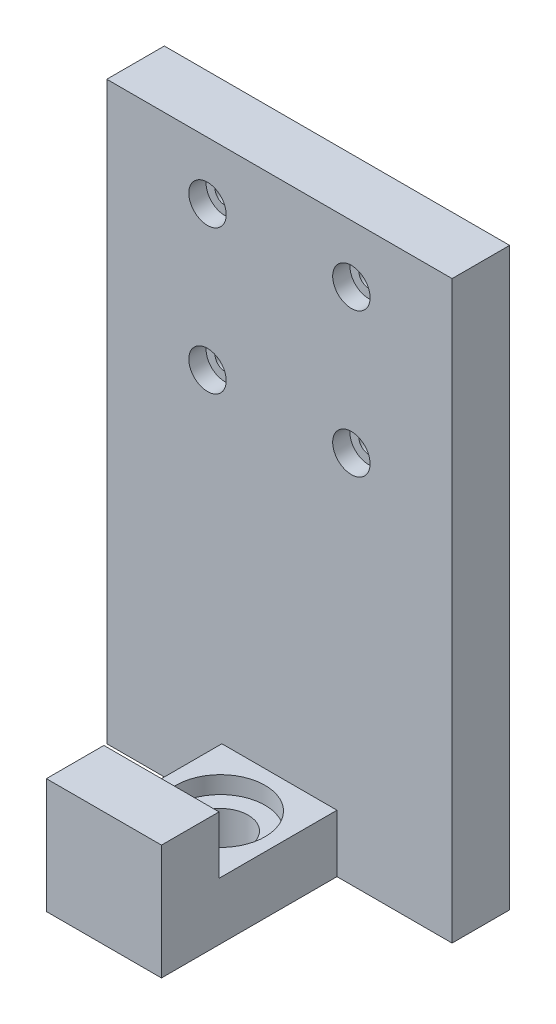
ISO-10303-21;
HEADER;
FILE_DESCRIPTION(('STEP AP214'),'2;1');
FILE_NAME('part.step','',(''),(''),'','','');
FILE_SCHEMA(('AUTOMOTIVE_DESIGN { 1 0 10303 214 1 1 1 1 }'));
ENDSEC;
DATA;
#1=APPLICATION_CONTEXT('core data for automotive mechanical design processes');
#2=APPLICATION_PROTOCOL_DEFINITION('international standard','automotive_design',2000,#1);
#3=PRODUCT_CONTEXT('',#1,'mechanical');
#4=PRODUCT('Part','Part','',(#3));
#5=PRODUCT_RELATED_PRODUCT_CATEGORY('part','',(#4));
#6=PRODUCT_DEFINITION_FORMATION('','',#4);
#7=PRODUCT_DEFINITION_CONTEXT('part definition',#1,'design');
#8=PRODUCT_DEFINITION('design','',#6,#7);
#9=PRODUCT_DEFINITION_SHAPE('','',#8);
#10=(LENGTH_UNIT() NAMED_UNIT(*) SI_UNIT(.MILLI.,.METRE.));
#11=(NAMED_UNIT(*) PLANE_ANGLE_UNIT() SI_UNIT($,.RADIAN.));
#12=(NAMED_UNIT(*) SI_UNIT($,.STERADIAN.) SOLID_ANGLE_UNIT());
#13=UNCERTAINTY_MEASURE_WITH_UNIT(LENGTH_MEASURE(1.E-05),#10,'distance_accuracy_value','');
#14=(GEOMETRIC_REPRESENTATION_CONTEXT(3) GLOBAL_UNCERTAINTY_ASSIGNED_CONTEXT((#13)) GLOBAL_UNIT_ASSIGNED_CONTEXT((#10,
#11,#12)) REPRESENTATION_CONTEXT('',''));
#15=CARTESIAN_POINT('',(0.,0.,0.));
#16=DIRECTION('',(0.,0.,1.));
#17=DIRECTION('',(1.,0.,0.));
#18=AXIS2_PLACEMENT_3D('',#15,#16,#17);
#19=CARTESIAN_POINT('',(-19.2632914223823,-11.696004332368,40.5));
#20=DIRECTION('',(0.,-1.,0.));
#21=DIRECTION('',(0.,0.,-1.));
#22=AXIS2_PLACEMENT_3D('',#19,#20,#21);
#23=PLANE('',#22);
#24=CARTESIAN_POINT('',(-9.26329142238234,-11.696004332368,20.25));
#25=DIRECTION('',(0.,1.,0.));
#26=DIRECTION('',(0.,0.,1.));
#27=AXIS2_PLACEMENT_3D('',#24,#25,#26);
#28=CIRCLE('',#27,7.75);
#29=CARTESIAN_POINT('',(-9.26329142238234,-11.696004332368,28.));
#30=VERTEX_POINT('',#29);
#31=EDGE_CURVE('E143',#30,#30,#28,.T.);
#32=ORIENTED_EDGE('',*,*,#31,.F.);
#33=EDGE_LOOP('',(#32));
#34=FACE_BOUND('',#33,.T.);
#35=DIRECTION('',(-1.,0.,0.));
#36=VECTOR('',#35,1.);
#37=CARTESIAN_POINT('',(-19.2632914223823,-11.696004332368,30.5));
#38=LINE('',#37,#36);
#39=CARTESIAN_POINT('',(0.736708577617665,-11.696004332368,30.5));
#40=VERTEX_POINT('',#39);
#41=CARTESIAN_POINT('',(-19.2632914223823,-11.696004332368,30.5));
#42=VERTEX_POINT('',#41);
#43=EDGE_CURVE('E138',#40,#42,#38,.T.);
#44=ORIENTED_EDGE('',*,*,#43,.F.);
#45=DIRECTION('',(0.,0.,-1.));
#46=VECTOR('',#45,1.);
#47=CARTESIAN_POINT('',(0.736708577617665,-11.696004332368,40.5));
#48=LINE('',#47,#46);
#49=CARTESIAN_POINT('',(0.736708577617665,-11.696004332368,10.));
#50=VERTEX_POINT('',#49);
#51=EDGE_CURVE('E158',#40,#50,#48,.T.);
#52=ORIENTED_EDGE('',*,*,#51,.T.);
#53=DIRECTION('',(-1.,0.,0.));
#54=VECTOR('',#53,1.);
#55=CARTESIAN_POINT('',(-19.2632914223823,-11.696004332368,10.));
#56=LINE('',#55,#54);
#57=CARTESIAN_POINT('',(-19.2632914223823,-11.696004332368,10.));
#58=VERTEX_POINT('',#57);
#59=EDGE_CURVE('E123',#50,#58,#56,.T.);
#60=ORIENTED_EDGE('',*,*,#59,.T.);
#61=DIRECTION('',(0.,0.,-1.));
#62=VECTOR('',#61,1.);
#63=CARTESIAN_POINT('',(-19.2632914223823,-11.696004332368,40.5));
#64=LINE('',#63,#62);
#65=EDGE_CURVE('E49',#42,#58,#64,.T.);
#66=ORIENTED_EDGE('',*,*,#65,.F.);
#67=EDGE_LOOP('',(#44,#52,#60,#66));
#68=FACE_BOUND('',#67,.T.);
#69=ADVANCED_FACE('F31',(#34,#68),#23,.F.);
#70=CARTESIAN_POINT('',(-39.2632914223823,78.303995667632,10.));
#71=DIRECTION('',(1.,0.,0.));
#72=DIRECTION('',(0.,1.,0.));
#73=AXIS2_PLACEMENT_3D('',#70,#71,#72);
#74=PLANE('',#73);
#75=DIRECTION('',(0.,-1.,0.));
#76=VECTOR('',#75,1.);
#77=CARTESIAN_POINT('',(-39.2632914223823,78.303995667632,0.));
#78=LINE('',#77,#76);
#79=CARTESIAN_POINT('',(-39.2632914223823,78.303995667632,0.));
#80=VERTEX_POINT('',#79);
#81=CARTESIAN_POINT('',(-39.2632914223823,-21.696004332368,0.));
#82=VERTEX_POINT('',#81);
#83=EDGE_CURVE('E190',#80,#82,#78,.T.);
#84=ORIENTED_EDGE('',*,*,#83,.T.);
#85=DIRECTION('',(0.,0.,-1.));
#86=VECTOR('',#85,1.);
#87=CARTESIAN_POINT('',(-39.2632914223823,-21.696004332368,10.));
#88=LINE('',#87,#86);
#89=CARTESIAN_POINT('',(-39.2632914223823,-21.696004332368,10.));
#90=VERTEX_POINT('',#89);
#91=EDGE_CURVE('E11',#90,#82,#88,.T.);
#92=ORIENTED_EDGE('',*,*,#91,.F.);
#93=DIRECTION('',(0.,-1.,0.));
#94=VECTOR('',#93,1.);
#95=CARTESIAN_POINT('',(-39.2632914223823,78.303995667632,10.));
#96=LINE('',#95,#94);
#97=CARTESIAN_POINT('',(-39.2632914223823,78.303995667632,10.));
#98=VERTEX_POINT('',#97);
#99=EDGE_CURVE('E161',#98,#90,#96,.T.);
#100=ORIENTED_EDGE('',*,*,#99,.F.);
#101=DIRECTION('',(0.,0.,-1.));
#102=VECTOR('',#101,1.);
#103=CARTESIAN_POINT('',(-39.2632914223823,78.303995667632,10.));
#104=LINE('',#103,#102);
#105=EDGE_CURVE('E181',#98,#80,#104,.T.);
#106=ORIENTED_EDGE('',*,*,#105,.T.);
#107=EDGE_LOOP('',(#84,#92,#100,#106));
#108=FACE_BOUND('',#107,.T.);
#109=ADVANCED_FACE('F33',(#108),#74,.F.);
#110=CARTESIAN_POINT('',(-39.2632914223823,-21.696004332368,10.));
#111=DIRECTION('',(0.,1.,0.));
#112=DIRECTION('',(0.,0.,1.));
#113=AXIS2_PLACEMENT_3D('',#110,#111,#112);
#114=PLANE('',#113);
#115=CARTESIAN_POINT('',(-9.26329142238234,-21.696004332368,20.25));
#116=DIRECTION('',(0.,1.,0.));
#117=DIRECTION('',(0.,0.,1.));
#118=AXIS2_PLACEMENT_3D('',#115,#116,#117);
#119=CIRCLE('',#118,4.8);
#120=CARTESIAN_POINT('',(-9.26329142238234,-21.696004332368,25.05));
#121=VERTEX_POINT('',#120);
#122=EDGE_CURVE('E377',#121,#121,#119,.T.);
#123=ORIENTED_EDGE('',*,*,#122,.T.);
#124=EDGE_LOOP('',(#123));
#125=FACE_BOUND('',#124,.T.);
#126=DIRECTION('',(1.,0.,0.));
#127=VECTOR('',#126,1.);
#128=CARTESIAN_POINT('',(-39.2632914223823,-21.696004332368,0.));
#129=LINE('',#128,#127);
#130=CARTESIAN_POINT('',(20.7367085776177,-21.696004332368,0.));
#131=VERTEX_POINT('',#130);
#132=EDGE_CURVE('E188',#82,#131,#129,.T.);
#133=ORIENTED_EDGE('',*,*,#132,.T.);
#134=DIRECTION('',(0.,0.,-1.));
#135=VECTOR('',#134,1.);
#136=CARTESIAN_POINT('',(20.7367085776177,-21.696004332368,10.));
#137=LINE('',#136,#135);
#138=CARTESIAN_POINT('',(20.7367085776177,-21.696004332368,10.));
#139=VERTEX_POINT('',#138);
#140=EDGE_CURVE('E41',#139,#131,#137,.T.);
#141=ORIENTED_EDGE('',*,*,#140,.F.);
#142=DIRECTION('',(1.,0.,0.));
#143=VECTOR('',#142,1.);
#144=CARTESIAN_POINT('',(-39.2632914223823,-21.696004332368,10.));
#145=LINE('',#144,#143);
#146=CARTESIAN_POINT('',(0.736708577617665,-21.696004332368,10.));
#147=VERTEX_POINT('',#146);
#148=EDGE_CURVE('E164',#147,#139,#145,.T.);
#149=ORIENTED_EDGE('',*,*,#148,.F.);
#150=DIRECTION('',(0.,0.,-1.));
#151=VECTOR('',#150,1.);
#152=CARTESIAN_POINT('',(0.73670857761767,-21.696004332368,40.5));
#153=LINE('',#152,#151);
#154=CARTESIAN_POINT('',(0.73670857761767,-21.696004332368,40.5));
#155=VERTEX_POINT('',#154);
#156=EDGE_CURVE('E160',#155,#147,#153,.T.);
#157=ORIENTED_EDGE('',*,*,#156,.F.);
#158=DIRECTION('',(1.,0.,0.));
#159=VECTOR('',#158,1.);
#160=CARTESIAN_POINT('',(-19.2632914223823,-21.696004332368,40.5));
#161=LINE('',#160,#159);
#162=CARTESIAN_POINT('',(-19.2632914223823,-21.696004332368,40.5));
#163=VERTEX_POINT('',#162);
#164=EDGE_CURVE('E122',#163,#155,#161,.T.);
#165=ORIENTED_EDGE('',*,*,#164,.F.);
#166=DIRECTION('',(0.,0.,-1.));
#167=VECTOR('',#166,1.);
#168=CARTESIAN_POINT('',(-19.2632914223823,-21.696004332368,40.5));
#169=LINE('',#168,#167);
#170=CARTESIAN_POINT('',(-19.2632914223823,-21.696004332368,10.));
#171=VERTEX_POINT('',#170);
#172=EDGE_CURVE('E120',#163,#171,#169,.T.);
#173=ORIENTED_EDGE('',*,*,#172,.T.);
#174=EDGE_CURVE('E174',#90,#171,#145,.T.);
#175=ORIENTED_EDGE('',*,*,#174,.F.);
#176=ORIENTED_EDGE('',*,*,#91,.T.);
#177=EDGE_LOOP('',(#133,#141,#149,#157,#165,#173,#175,#176));
#178=FACE_BOUND('',#177,.T.);
#179=ADVANCED_FACE('F209',(#125,#178),#114,.F.);
#180=CARTESIAN_POINT('',(20.7367085776177,78.303995667632,10.));
#181=DIRECTION('',(-1.,0.,0.));
#182=DIRECTION('',(0.,-1.,0.));
#183=AXIS2_PLACEMENT_3D('',#180,#181,#182);
#184=PLANE('',#183);
#185=DIRECTION('',(0.,1.,0.));
#186=VECTOR('',#185,1.);
#187=CARTESIAN_POINT('',(20.7367085776177,78.303995667632,0.));
#188=LINE('',#187,#186);
#189=CARTESIAN_POINT('',(20.7367085776177,78.303995667632,0.));
#190=VERTEX_POINT('',#189);
#191=EDGE_CURVE('E186',#131,#190,#188,.T.);
#192=ORIENTED_EDGE('',*,*,#191,.T.);
#193=DIRECTION('',(0.,0.,-1.));
#194=VECTOR('',#193,1.);
#195=CARTESIAN_POINT('',(20.7367085776177,78.303995667632,10.));
#196=LINE('',#195,#194);
#197=CARTESIAN_POINT('',(20.7367085776177,78.303995667632,10.));
#198=VERTEX_POINT('',#197);
#199=EDGE_CURVE('E178',#198,#190,#196,.T.);
#200=ORIENTED_EDGE('',*,*,#199,.F.);
#201=DIRECTION('',(0.,1.,0.));
#202=VECTOR('',#201,1.);
#203=CARTESIAN_POINT('',(20.7367085776177,78.303995667632,10.));
#204=LINE('',#203,#202);
#205=EDGE_CURVE('E168',#139,#198,#204,.T.);
#206=ORIENTED_EDGE('',*,*,#205,.F.);
#207=ORIENTED_EDGE('',*,*,#140,.T.);
#208=EDGE_LOOP('',(#192,#200,#206,#207));
#209=FACE_BOUND('',#208,.T.);
#210=ADVANCED_FACE('F199',(#209),#184,.F.);
#211=CARTESIAN_POINT('',(-39.2632914223823,78.303995667632,10.));
#212=DIRECTION('',(0.,-1.,0.));
#213=DIRECTION('',(0.,0.,-1.));
#214=AXIS2_PLACEMENT_3D('',#211,#212,#213);
#215=PLANE('',#214);
#216=DIRECTION('',(-1.,0.,0.));
#217=VECTOR('',#216,1.);
#218=CARTESIAN_POINT('',(-39.2632914223823,78.303995667632,0.));
#219=LINE('',#218,#217);
#220=EDGE_CURVE('E165',#190,#80,#219,.T.);
#221=ORIENTED_EDGE('',*,*,#220,.T.);
#222=ORIENTED_EDGE('',*,*,#105,.F.);
#223=DIRECTION('',(-1.,0.,0.));
#224=VECTOR('',#223,1.);
#225=CARTESIAN_POINT('',(-39.2632914223823,78.303995667632,10.));
#226=LINE('',#225,#224);
#227=EDGE_CURVE('E184',#198,#98,#226,.T.);
#228=ORIENTED_EDGE('',*,*,#227,.F.);
#229=ORIENTED_EDGE('',*,*,#199,.T.);
#230=EDGE_LOOP('',(#221,#222,#228,#229));
#231=FACE_BOUND('',#230,.T.);
#232=ADVANCED_FACE('F203',(#231),#215,.F.);
#233=CARTESIAN_POINT('',(-39.2632914223823,-21.696004332368,10.));
#234=DIRECTION('',(0.,0.,1.));
#235=DIRECTION('',(1.,0.,0.));
#236=AXIS2_PLACEMENT_3D('',#233,#234,#235);
#237=PLANE('',#236);
#238=CARTESIAN_POINT('',(-21.7632914223823,68.303995667632,10.));
#239=DIRECTION('',(0.,0.,1.));
#240=DIRECTION('',(1.,0.,0.));
#241=AXIS2_PLACEMENT_3D('',#238,#239,#240);
#242=CIRCLE('',#241,3.25);
#243=CARTESIAN_POINT('',(-18.5132914223823,68.303995667632,10.));
#244=VERTEX_POINT('',#243);
#245=EDGE_CURVE('E332',#244,#244,#242,.T.);
#246=ORIENTED_EDGE('',*,*,#245,.F.);
#247=EDGE_LOOP('',(#246));
#248=FACE_BOUND('',#247,.T.);
#249=CARTESIAN_POINT('',(-21.7632914223823,43.303995667632,10.));
#250=DIRECTION('',(0.,0.,1.));
#251=DIRECTION('',(1.,0.,0.));
#252=AXIS2_PLACEMENT_3D('',#249,#250,#251);
#253=CIRCLE('',#252,3.25);
#254=CARTESIAN_POINT('',(-18.5132914223823,43.303995667632,10.));
#255=VERTEX_POINT('',#254);
#256=EDGE_CURVE('E347',#255,#255,#253,.T.);
#257=ORIENTED_EDGE('',*,*,#256,.F.);
#258=EDGE_LOOP('',(#257));
#259=FACE_BOUND('',#258,.T.);
#260=CARTESIAN_POINT('',(3.23670857761767,68.303995667632,10.));
#261=DIRECTION('',(0.,0.,1.));
#262=DIRECTION('',(1.,0.,0.));
#263=AXIS2_PLACEMENT_3D('',#260,#261,#262);
#264=CIRCLE('',#263,3.25);
#265=CARTESIAN_POINT('',(6.48670857761767,68.303995667632,10.));
#266=VERTEX_POINT('',#265);
#267=EDGE_CURVE('E359',#266,#266,#264,.T.);
#268=ORIENTED_EDGE('',*,*,#267,.F.);
#269=EDGE_LOOP('',(#268));
#270=FACE_BOUND('',#269,.T.);
#271=CARTESIAN_POINT('',(3.23670857761766,43.303995667632,10.));
#272=DIRECTION('',(0.,0.,1.));
#273=DIRECTION('',(1.,0.,0.));
#274=AXIS2_PLACEMENT_3D('',#271,#272,#273);
#275=CIRCLE('',#274,3.25);
#276=CARTESIAN_POINT('',(6.48670857761766,43.303995667632,10.));
#277=VERTEX_POINT('',#276);
#278=EDGE_CURVE('E371',#277,#277,#275,.T.);
#279=ORIENTED_EDGE('',*,*,#278,.F.);
#280=EDGE_LOOP('',(#279));
#281=FACE_BOUND('',#280,.T.);
#282=DIRECTION('',(0.,-1.,0.));
#283=VECTOR('',#282,1.);
#284=CARTESIAN_POINT('',(-19.2632914223823,-11.696004332368,10.));
#285=LINE('',#284,#283);
#286=EDGE_CURVE('E35',#58,#171,#285,.T.);
#287=ORIENTED_EDGE('',*,*,#286,.F.);
#288=ORIENTED_EDGE('',*,*,#59,.F.);
#289=DIRECTION('',(0.,1.,0.));
#290=VECTOR('',#289,1.);
#291=CARTESIAN_POINT('',(0.736708577617665,-11.696004332368,10.));
#292=LINE('',#291,#290);
#293=EDGE_CURVE('E57',#147,#50,#292,.T.);
#294=ORIENTED_EDGE('',*,*,#293,.F.);
#295=ORIENTED_EDGE('',*,*,#148,.T.);
#296=ORIENTED_EDGE('',*,*,#205,.T.);
#297=ORIENTED_EDGE('',*,*,#227,.T.);
#298=ORIENTED_EDGE('',*,*,#99,.T.);
#299=ORIENTED_EDGE('',*,*,#174,.T.);
#300=EDGE_LOOP('',(#287,#288,#294,#295,#296,#297,#298,#299));
#301=FACE_BOUND('',#300,.T.);
#302=ADVANCED_FACE('F196',(#248,#259,#270,#281,#301),#237,.T.);
#303=CARTESIAN_POINT('',(-39.2632914223823,-21.696004332368,0.));
#304=DIRECTION('',(0.,0.,1.));
#305=DIRECTION('',(1.,0.,0.));
#306=AXIS2_PLACEMENT_3D('',#303,#304,#305);
#307=PLANE('',#306);
#308=CARTESIAN_POINT('',(-21.7632914223823,68.303995667632,0.));
#309=DIRECTION('',(0.,0.,1.));
#310=DIRECTION('',(1.,0.,0.));
#311=AXIS2_PLACEMENT_3D('',#308,#309,#310);
#312=CIRCLE('',#311,1.7);
#313=CARTESIAN_POINT('',(-20.0632914223823,68.303995667632,0.));
#314=VERTEX_POINT('',#313);
#315=EDGE_CURVE('E325',#314,#314,#312,.T.);
#316=ORIENTED_EDGE('',*,*,#315,.T.);
#317=EDGE_LOOP('',(#316));
#318=FACE_BOUND('',#317,.T.);
#319=CARTESIAN_POINT('',(-21.7632914223823,43.303995667632,0.));
#320=DIRECTION('',(0.,0.,1.));
#321=DIRECTION('',(1.,0.,0.));
#322=AXIS2_PLACEMENT_3D('',#319,#320,#321);
#323=CIRCLE('',#322,1.7);
#324=CARTESIAN_POINT('',(-20.0632914223823,43.303995667632,0.));
#325=VERTEX_POINT('',#324);
#326=EDGE_CURVE('E338',#325,#325,#323,.T.);
#327=ORIENTED_EDGE('',*,*,#326,.T.);
#328=EDGE_LOOP('',(#327));
#329=FACE_BOUND('',#328,.T.);
#330=CARTESIAN_POINT('',(3.23670857761767,68.303995667632,0.));
#331=DIRECTION('',(0.,0.,1.));
#332=DIRECTION('',(1.,0.,0.));
#333=AXIS2_PLACEMENT_3D('',#330,#331,#332);
#334=CIRCLE('',#333,1.7);
#335=CARTESIAN_POINT('',(4.93670857761766,68.303995667632,0.));
#336=VERTEX_POINT('',#335);
#337=EDGE_CURVE('E350',#336,#336,#334,.T.);
#338=ORIENTED_EDGE('',*,*,#337,.T.);
#339=EDGE_LOOP('',(#338));
#340=FACE_BOUND('',#339,.T.);
#341=CARTESIAN_POINT('',(3.23670857761766,43.303995667632,0.));
#342=DIRECTION('',(0.,0.,1.));
#343=DIRECTION('',(1.,0.,0.));
#344=AXIS2_PLACEMENT_3D('',#341,#342,#343);
#345=CIRCLE('',#344,1.7);
#346=CARTESIAN_POINT('',(4.93670857761766,43.303995667632,0.));
#347=VERTEX_POINT('',#346);
#348=EDGE_CURVE('E362',#347,#347,#345,.T.);
#349=ORIENTED_EDGE('',*,*,#348,.T.);
#350=EDGE_LOOP('',(#349));
#351=FACE_BOUND('',#350,.T.);
#352=ORIENTED_EDGE('',*,*,#83,.F.);
#353=ORIENTED_EDGE('',*,*,#220,.F.);
#354=ORIENTED_EDGE('',*,*,#191,.F.);
#355=ORIENTED_EDGE('',*,*,#132,.F.);
#356=EDGE_LOOP('',(#352,#353,#354,#355));
#357=FACE_BOUND('',#356,.T.);
#358=ADVANCED_FACE('F223',(#318,#329,#340,#351,#357),#307,.F.);
#359=CARTESIAN_POINT('',(-19.2632914223823,-11.696004332368,40.5));
#360=DIRECTION('',(1.,0.,0.));
#361=DIRECTION('',(0.,1.,0.));
#362=AXIS2_PLACEMENT_3D('',#359,#360,#361);
#363=PLANE('',#362);
#364=ORIENTED_EDGE('',*,*,#286,.T.);
#365=ORIENTED_EDGE('',*,*,#172,.F.);
#366=DIRECTION('',(0.,-1.,0.));
#367=VECTOR('',#366,1.);
#368=CARTESIAN_POINT('',(-19.2632914223823,-11.696004332368,40.5));
#369=LINE('',#368,#367);
#370=CARTESIAN_POINT('',(-19.2632914223823,-1.69600433236797,40.5));
#371=VERTEX_POINT('',#370);
#372=EDGE_CURVE('E114',#371,#163,#369,.T.);
#373=ORIENTED_EDGE('',*,*,#372,.F.);
#374=DIRECTION('',(0.,0.,1.));
#375=VECTOR('',#374,1.);
#376=CARTESIAN_POINT('',(-19.2632914223823,-1.69600433236797,40.5));
#377=LINE('',#376,#375);
#378=CARTESIAN_POINT('',(-19.2632914223823,-1.69600433236797,30.5));
#379=VERTEX_POINT('',#378);
#380=EDGE_CURVE('E118',#379,#371,#377,.T.);
#381=ORIENTED_EDGE('',*,*,#380,.F.);
#382=DIRECTION('',(0.,-1.,0.));
#383=VECTOR('',#382,1.);
#384=CARTESIAN_POINT('',(-19.2632914223823,-1.69600433236797,30.5));
#385=LINE('',#384,#383);
#386=EDGE_CURVE('E147',#379,#42,#385,.T.);
#387=ORIENTED_EDGE('',*,*,#386,.T.);
#388=ORIENTED_EDGE('',*,*,#65,.T.);
#389=EDGE_LOOP('',(#364,#365,#373,#381,#387,#388));
#390=FACE_BOUND('',#389,.T.);
#391=ADVANCED_FACE('F116',(#390),#363,.F.);
#392=CARTESIAN_POINT('',(0.736708577617665,-11.696004332368,40.5));
#393=DIRECTION('',(-1.,0.,0.));
#394=DIRECTION('',(0.,-1.,0.));
#395=AXIS2_PLACEMENT_3D('',#392,#393,#394);
#396=PLANE('',#395);
#397=ORIENTED_EDGE('',*,*,#293,.T.);
#398=ORIENTED_EDGE('',*,*,#51,.F.);
#399=DIRECTION('',(0.,-1.,0.));
#400=VECTOR('',#399,1.);
#401=CARTESIAN_POINT('',(0.736708577617665,-1.69600433236797,30.5));
#402=LINE('',#401,#400);
#403=CARTESIAN_POINT('',(0.736708577617665,-1.69600433236797,30.5));
#404=VERTEX_POINT('',#403);
#405=EDGE_CURVE('E150',#404,#40,#402,.T.);
#406=ORIENTED_EDGE('',*,*,#405,.F.);
#407=DIRECTION('',(0.,0.,-1.));
#408=VECTOR('',#407,1.);
#409=CARTESIAN_POINT('',(0.736708577617665,-1.69600433236797,40.5));
#410=LINE('',#409,#408);
#411=CARTESIAN_POINT('',(0.736708577617665,-1.69600433236797,40.5));
#412=VERTEX_POINT('',#411);
#413=EDGE_CURVE('E132',#412,#404,#410,.T.);
#414=ORIENTED_EDGE('',*,*,#413,.F.);
#415=DIRECTION('',(0.,1.,0.));
#416=VECTOR('',#415,1.);
#417=CARTESIAN_POINT('',(0.736708577617665,-11.696004332368,40.5));
#418=LINE('',#417,#416);
#419=EDGE_CURVE('E129',#155,#412,#418,.T.);
#420=ORIENTED_EDGE('',*,*,#419,.F.);
#421=ORIENTED_EDGE('',*,*,#156,.T.);
#422=EDGE_LOOP('',(#397,#398,#406,#414,#420,#421));
#423=FACE_BOUND('',#422,.T.);
#424=ADVANCED_FACE('F221',(#423),#396,.F.);
#425=CARTESIAN_POINT('',(-19.2632914223823,-21.696004332368,40.5));
#426=DIRECTION('',(0.,0.,1.));
#427=DIRECTION('',(1.,0.,0.));
#428=AXIS2_PLACEMENT_3D('',#425,#426,#427);
#429=PLANE('',#428);
#430=ORIENTED_EDGE('',*,*,#372,.T.);
#431=ORIENTED_EDGE('',*,*,#164,.T.);
#432=ORIENTED_EDGE('',*,*,#419,.T.);
#433=DIRECTION('',(1.,0.,0.));
#434=VECTOR('',#433,1.);
#435=CARTESIAN_POINT('',(-19.2632914223823,-1.69600433236797,40.5));
#436=LINE('',#435,#434);
#437=EDGE_CURVE('E126',#371,#412,#436,.T.);
#438=ORIENTED_EDGE('',*,*,#437,.F.);
#439=EDGE_LOOP('',(#430,#431,#432,#438));
#440=FACE_BOUND('',#439,.T.);
#441=ADVANCED_FACE('F127',(#440),#429,.T.);
#442=CARTESIAN_POINT('',(-19.2632914223823,-1.69600433236797,30.5));
#443=DIRECTION('',(0.,0.,1.));
#444=DIRECTION('',(1.,0.,0.));
#445=AXIS2_PLACEMENT_3D('',#442,#443,#444);
#446=PLANE('',#445);
#447=ORIENTED_EDGE('',*,*,#43,.T.);
#448=ORIENTED_EDGE('',*,*,#386,.F.);
#449=DIRECTION('',(-1.,0.,0.));
#450=VECTOR('',#449,1.);
#451=CARTESIAN_POINT('',(-19.2632914223823,-1.69600433236797,30.5));
#452=LINE('',#451,#450);
#453=EDGE_CURVE('E136',#404,#379,#452,.T.);
#454=ORIENTED_EDGE('',*,*,#453,.F.);
#455=ORIENTED_EDGE('',*,*,#405,.T.);
#456=EDGE_LOOP('',(#447,#448,#454,#455));
#457=FACE_BOUND('',#456,.T.);
#458=ADVANCED_FACE('F252',(#457),#446,.F.);
#459=CARTESIAN_POINT('',(-19.2632914223823,-1.69600433236797,30.5));
#460=DIRECTION('',(0.,-1.,0.));
#461=DIRECTION('',(0.,0.,-1.));
#462=AXIS2_PLACEMENT_3D('',#459,#460,#461);
#463=PLANE('',#462);
#464=ORIENTED_EDGE('',*,*,#380,.T.);
#465=ORIENTED_EDGE('',*,*,#437,.T.);
#466=ORIENTED_EDGE('',*,*,#413,.T.);
#467=ORIENTED_EDGE('',*,*,#453,.T.);
#468=EDGE_LOOP('',(#464,#465,#466,#467));
#469=FACE_BOUND('',#468,.T.);
#470=ADVANCED_FACE('F134',(#469),#463,.F.);
#471=CARTESIAN_POINT('',(-9.26329142238234,-14.696004332368,20.25));
#472=DIRECTION('',(0.,1.,0.));
#473=DIRECTION('',(0.,0.,1.));
#474=AXIS2_PLACEMENT_3D('',#471,#472,#473);
#475=CYLINDRICAL_SURFACE('',#474,7.75);
#476=CARTESIAN_POINT('',(-9.26329142238234,-14.696004332368,20.25));
#477=DIRECTION('',(0.,1.,0.));
#478=DIRECTION('',(0.,0.,1.));
#479=AXIS2_PLACEMENT_3D('',#476,#477,#478);
#480=CIRCLE('',#479,7.75);
#481=CARTESIAN_POINT('',(-9.26329142238234,-14.696004332368,28.));
#482=VERTEX_POINT('',#481);
#483=EDGE_CURVE('E140',#482,#482,#480,.T.);
#484=ORIENTED_EDGE('',*,*,#483,.F.);
#485=EDGE_LOOP('',(#484));
#486=FACE_BOUND('',#485,.T.);
#487=ORIENTED_EDGE('',*,*,#31,.T.);
#488=EDGE_LOOP('',(#487));
#489=FACE_BOUND('',#488,.T.);
#490=ADVANCED_FACE('F260',(#486,#489),#475,.F.);
#491=CARTESIAN_POINT('',(-9.26329142238234,-14.696004332368,20.25));
#492=DIRECTION('',(0.,1.,0.));
#493=DIRECTION('',(0.,0.,1.));
#494=AXIS2_PLACEMENT_3D('',#491,#492,#493);
#495=PLANE('',#494);
#496=CARTESIAN_POINT('',(-9.26329142238234,-14.696004332368,20.25));
#497=DIRECTION('',(0.,1.,0.));
#498=DIRECTION('',(0.,0.,1.));
#499=AXIS2_PLACEMENT_3D('',#496,#497,#498);
#500=CIRCLE('',#499,4.8);
#501=CARTESIAN_POINT('',(-9.26329142238234,-14.696004332368,25.05));
#502=VERTEX_POINT('',#501);
#503=EDGE_CURVE('E374',#502,#502,#500,.T.);
#504=ORIENTED_EDGE('',*,*,#503,.F.);
#505=EDGE_LOOP('',(#504));
#506=FACE_BOUND('',#505,.T.);
#507=ORIENTED_EDGE('',*,*,#483,.T.);
#508=EDGE_LOOP('',(#507));
#509=FACE_BOUND('',#508,.T.);
#510=ADVANCED_FACE('F265',(#506,#509),#495,.T.);
#511=CARTESIAN_POINT('',(-9.26329142238234,-21.696054332368,20.25));
#512=DIRECTION('',(0.,1.,0.));
#513=DIRECTION('',(0.,0.,1.));
#514=AXIS2_PLACEMENT_3D('',#511,#512,#513);
#515=CYLINDRICAL_SURFACE('',#514,4.8);
#516=ORIENTED_EDGE('',*,*,#503,.T.);
#517=EDGE_LOOP('',(#516));
#518=FACE_BOUND('',#517,.T.);
#519=ORIENTED_EDGE('',*,*,#122,.F.);
#520=EDGE_LOOP('',(#519));
#521=FACE_BOUND('',#520,.T.);
#522=ADVANCED_FACE('F269',(#518,#521),#515,.F.);
#523=CARTESIAN_POINT('',(3.23670857761766,43.303995667632,10.));
#524=DIRECTION('',(0.,0.,1.));
#525=DIRECTION('',(1.,0.,0.));
#526=AXIS2_PLACEMENT_3D('',#523,#524,#525);
#527=CYLINDRICAL_SURFACE('',#526,3.25);
#528=CARTESIAN_POINT('',(3.23670857761766,43.303995667632,7.));
#529=DIRECTION('',(0.,0.,1.));
#530=DIRECTION('',(1.,0.,0.));
#531=AXIS2_PLACEMENT_3D('',#528,#529,#530);
#532=CIRCLE('',#531,3.25);
#533=CARTESIAN_POINT('',(6.48670857761766,43.303995667632,7.));
#534=VERTEX_POINT('',#533);
#535=EDGE_CURVE('E368',#534,#534,#532,.T.);
#536=ORIENTED_EDGE('',*,*,#535,.F.);
#537=EDGE_LOOP('',(#536));
#538=FACE_BOUND('',#537,.T.);
#539=ORIENTED_EDGE('',*,*,#278,.T.);
#540=EDGE_LOOP('',(#539));
#541=FACE_BOUND('',#540,.T.);
#542=ADVANCED_FACE('F273',(#538,#541),#527,.F.);
#543=CARTESIAN_POINT('',(4.93670857761766,43.303995667632,7.));
#544=DIRECTION('',(0.,0.,-1.));
#545=DIRECTION('',(-1.,0.,0.));
#546=AXIS2_PLACEMENT_3D('',#543,#544,#545);
#547=PLANE('',#546);
#548=CARTESIAN_POINT('',(3.23670857761766,43.303995667632,7.));
#549=DIRECTION('',(0.,0.,1.));
#550=DIRECTION('',(1.,0.,0.));
#551=AXIS2_PLACEMENT_3D('',#548,#549,#550);
#552=CIRCLE('',#551,1.7);
#553=CARTESIAN_POINT('',(4.93670857761766,43.303995667632,7.));
#554=VERTEX_POINT('',#553);
#555=EDGE_CURVE('E365',#554,#554,#552,.T.);
#556=ORIENTED_EDGE('',*,*,#555,.F.);
#557=EDGE_LOOP('',(#556));
#558=FACE_BOUND('',#557,.T.);
#559=ORIENTED_EDGE('',*,*,#535,.T.);
#560=EDGE_LOOP('',(#559));
#561=FACE_BOUND('',#560,.T.);
#562=ADVANCED_FACE('F277',(#558,#561),#547,.F.);
#563=CARTESIAN_POINT('',(3.23670857761766,43.303995667632,10.));
#564=DIRECTION('',(0.,0.,1.));
#565=DIRECTION('',(1.,0.,0.));
#566=AXIS2_PLACEMENT_3D('',#563,#564,#565);
#567=CYLINDRICAL_SURFACE('',#566,1.7);
#568=ORIENTED_EDGE('',*,*,#348,.F.);
#569=EDGE_LOOP('',(#568));
#570=FACE_BOUND('',#569,.T.);
#571=ORIENTED_EDGE('',*,*,#555,.T.);
#572=EDGE_LOOP('',(#571));
#573=FACE_BOUND('',#572,.T.);
#574=ADVANCED_FACE('F281',(#570,#573),#567,.F.);
#575=CARTESIAN_POINT('',(3.23670857761767,68.303995667632,10.));
#576=DIRECTION('',(0.,0.,1.));
#577=DIRECTION('',(1.,0.,0.));
#578=AXIS2_PLACEMENT_3D('',#575,#576,#577);
#579=CYLINDRICAL_SURFACE('',#578,3.25);
#580=CARTESIAN_POINT('',(3.23670857761767,68.303995667632,7.));
#581=DIRECTION('',(0.,0.,1.));
#582=DIRECTION('',(1.,0.,0.));
#583=AXIS2_PLACEMENT_3D('',#580,#581,#582);
#584=CIRCLE('',#583,3.25);
#585=CARTESIAN_POINT('',(6.48670857761767,68.303995667632,7.));
#586=VERTEX_POINT('',#585);
#587=EDGE_CURVE('E356',#586,#586,#584,.T.);
#588=ORIENTED_EDGE('',*,*,#587,.F.);
#589=EDGE_LOOP('',(#588));
#590=FACE_BOUND('',#589,.T.);
#591=ORIENTED_EDGE('',*,*,#267,.T.);
#592=EDGE_LOOP('',(#591));
#593=FACE_BOUND('',#592,.T.);
#594=ADVANCED_FACE('F285',(#590,#593),#579,.F.);
#595=CARTESIAN_POINT('',(4.93670857761767,68.303995667632,7.));
#596=DIRECTION('',(0.,0.,-1.));
#597=DIRECTION('',(-1.,0.,0.));
#598=AXIS2_PLACEMENT_3D('',#595,#596,#597);
#599=PLANE('',#598);
#600=CARTESIAN_POINT('',(3.23670857761767,68.303995667632,7.));
#601=DIRECTION('',(0.,0.,1.));
#602=DIRECTION('',(1.,0.,0.));
#603=AXIS2_PLACEMENT_3D('',#600,#601,#602);
#604=CIRCLE('',#603,1.7);
#605=CARTESIAN_POINT('',(4.93670857761767,68.303995667632,7.));
#606=VERTEX_POINT('',#605);
#607=EDGE_CURVE('E353',#606,#606,#604,.T.);
#608=ORIENTED_EDGE('',*,*,#607,.F.);
#609=EDGE_LOOP('',(#608));
#610=FACE_BOUND('',#609,.T.);
#611=ORIENTED_EDGE('',*,*,#587,.T.);
#612=EDGE_LOOP('',(#611));
#613=FACE_BOUND('',#612,.T.);
#614=ADVANCED_FACE('F289',(#610,#613),#599,.F.);
#615=CARTESIAN_POINT('',(3.23670857761767,68.303995667632,10.));
#616=DIRECTION('',(0.,0.,1.));
#617=DIRECTION('',(1.,0.,0.));
#618=AXIS2_PLACEMENT_3D('',#615,#616,#617);
#619=CYLINDRICAL_SURFACE('',#618,1.7);
#620=ORIENTED_EDGE('',*,*,#337,.F.);
#621=EDGE_LOOP('',(#620));
#622=FACE_BOUND('',#621,.T.);
#623=ORIENTED_EDGE('',*,*,#607,.T.);
#624=EDGE_LOOP('',(#623));
#625=FACE_BOUND('',#624,.T.);
#626=ADVANCED_FACE('F293',(#622,#625),#619,.F.);
#627=CARTESIAN_POINT('',(-21.7632914223823,43.303995667632,10.));
#628=DIRECTION('',(0.,0.,1.));
#629=DIRECTION('',(1.,0.,0.));
#630=AXIS2_PLACEMENT_3D('',#627,#628,#629);
#631=CYLINDRICAL_SURFACE('',#630,3.25);
#632=CARTESIAN_POINT('',(-21.7632914223823,43.303995667632,7.));
#633=DIRECTION('',(0.,0.,1.));
#634=DIRECTION('',(1.,0.,0.));
#635=AXIS2_PLACEMENT_3D('',#632,#633,#634);
#636=CIRCLE('',#635,3.25);
#637=CARTESIAN_POINT('',(-18.5132914223823,43.303995667632,7.));
#638=VERTEX_POINT('',#637);
#639=EDGE_CURVE('E344',#638,#638,#636,.T.);
#640=ORIENTED_EDGE('',*,*,#639,.F.);
#641=EDGE_LOOP('',(#640));
#642=FACE_BOUND('',#641,.T.);
#643=ORIENTED_EDGE('',*,*,#256,.T.);
#644=EDGE_LOOP('',(#643));
#645=FACE_BOUND('',#644,.T.);
#646=ADVANCED_FACE('F297',(#642,#645),#631,.F.);
#647=CARTESIAN_POINT('',(-20.0632914223823,43.303995667632,7.));
#648=DIRECTION('',(0.,0.,-1.));
#649=DIRECTION('',(-1.,0.,0.));
#650=AXIS2_PLACEMENT_3D('',#647,#648,#649);
#651=PLANE('',#650);
#652=CARTESIAN_POINT('',(-21.7632914223823,43.303995667632,7.));
#653=DIRECTION('',(0.,0.,1.));
#654=DIRECTION('',(1.,0.,0.));
#655=AXIS2_PLACEMENT_3D('',#652,#653,#654);
#656=CIRCLE('',#655,1.7);
#657=CARTESIAN_POINT('',(-20.0632914223823,43.303995667632,7.));
#658=VERTEX_POINT('',#657);
#659=EDGE_CURVE('E341',#658,#658,#656,.T.);
#660=ORIENTED_EDGE('',*,*,#659,.F.);
#661=EDGE_LOOP('',(#660));
#662=FACE_BOUND('',#661,.T.);
#663=ORIENTED_EDGE('',*,*,#639,.T.);
#664=EDGE_LOOP('',(#663));
#665=FACE_BOUND('',#664,.T.);
#666=ADVANCED_FACE('F301',(#662,#665),#651,.F.);
#667=CARTESIAN_POINT('',(-21.7632914223823,43.303995667632,10.));
#668=DIRECTION('',(0.,0.,1.));
#669=DIRECTION('',(1.,0.,0.));
#670=AXIS2_PLACEMENT_3D('',#667,#668,#669);
#671=CYLINDRICAL_SURFACE('',#670,1.7);
#672=ORIENTED_EDGE('',*,*,#326,.F.);
#673=EDGE_LOOP('',(#672));
#674=FACE_BOUND('',#673,.T.);
#675=ORIENTED_EDGE('',*,*,#659,.T.);
#676=EDGE_LOOP('',(#675));
#677=FACE_BOUND('',#676,.T.);
#678=ADVANCED_FACE('F305',(#674,#677),#671,.F.);
#679=CARTESIAN_POINT('',(-21.7632914223823,68.303995667632,10.));
#680=DIRECTION('',(0.,0.,1.));
#681=DIRECTION('',(1.,0.,0.));
#682=AXIS2_PLACEMENT_3D('',#679,#680,#681);
#683=CYLINDRICAL_SURFACE('',#682,3.25);
#684=CARTESIAN_POINT('',(-21.7632914223823,68.303995667632,7.));
#685=DIRECTION('',(0.,0.,1.));
#686=DIRECTION('',(1.,0.,0.));
#687=AXIS2_PLACEMENT_3D('',#684,#685,#686);
#688=CIRCLE('',#687,3.25);
#689=CARTESIAN_POINT('',(-18.5132914223823,68.303995667632,7.));
#690=VERTEX_POINT('',#689);
#691=EDGE_CURVE('E329',#690,#690,#688,.T.);
#692=ORIENTED_EDGE('',*,*,#691,.F.);
#693=EDGE_LOOP('',(#692));
#694=FACE_BOUND('',#693,.T.);
#695=ORIENTED_EDGE('',*,*,#245,.T.);
#696=EDGE_LOOP('',(#695));
#697=FACE_BOUND('',#696,.T.);
#698=ADVANCED_FACE('F309',(#694,#697),#683,.F.);
#699=CARTESIAN_POINT('',(-20.0632914223823,68.303995667632,7.));
#700=DIRECTION('',(0.,0.,-1.));
#701=DIRECTION('',(-1.,0.,0.));
#702=AXIS2_PLACEMENT_3D('',#699,#700,#701);
#703=PLANE('',#702);
#704=CARTESIAN_POINT('',(-21.7632914223823,68.303995667632,7.));
#705=DIRECTION('',(0.,0.,1.));
#706=DIRECTION('',(1.,0.,0.));
#707=AXIS2_PLACEMENT_3D('',#704,#705,#706);
#708=CIRCLE('',#707,1.7);
#709=CARTESIAN_POINT('',(-20.0632914223823,68.303995667632,7.));
#710=VERTEX_POINT('',#709);
#711=EDGE_CURVE('E328',#710,#710,#708,.T.);
#712=ORIENTED_EDGE('',*,*,#711,.F.);
#713=EDGE_LOOP('',(#712));
#714=FACE_BOUND('',#713,.T.);
#715=ORIENTED_EDGE('',*,*,#691,.T.);
#716=EDGE_LOOP('',(#715));
#717=FACE_BOUND('',#716,.T.);
#718=ADVANCED_FACE('F313',(#714,#717),#703,.F.);
#719=CARTESIAN_POINT('',(-21.7632914223823,68.303995667632,10.));
#720=DIRECTION('',(0.,0.,1.));
#721=DIRECTION('',(1.,0.,0.));
#722=AXIS2_PLACEMENT_3D('',#719,#720,#721);
#723=CYLINDRICAL_SURFACE('',#722,1.7);
#724=ORIENTED_EDGE('',*,*,#315,.F.);
#725=EDGE_LOOP('',(#724));
#726=FACE_BOUND('',#725,.T.);
#727=ORIENTED_EDGE('',*,*,#711,.T.);
#728=EDGE_LOOP('',(#727));
#729=FACE_BOUND('',#728,.T.);
#730=ADVANCED_FACE('F317',(#726,#729),#723,.F.);
#731=CLOSED_SHELL('',(#69,#109,#179,#210,#232,#302,#358,#391,#424,#441,#458,#470,#490,#510,#522,
#542,#562,#574,#594,#614,#626,#646,#666,#678,#698,#718,#730));
#732=MANIFOLD_SOLID_BREP('B2',#731);
#733=ADVANCED_BREP_SHAPE_REPRESENTATION('',(#18,#732),#14);
#734=SHAPE_DEFINITION_REPRESENTATION(#9,#733);
ENDSEC;
END-ISO-10303-21;
